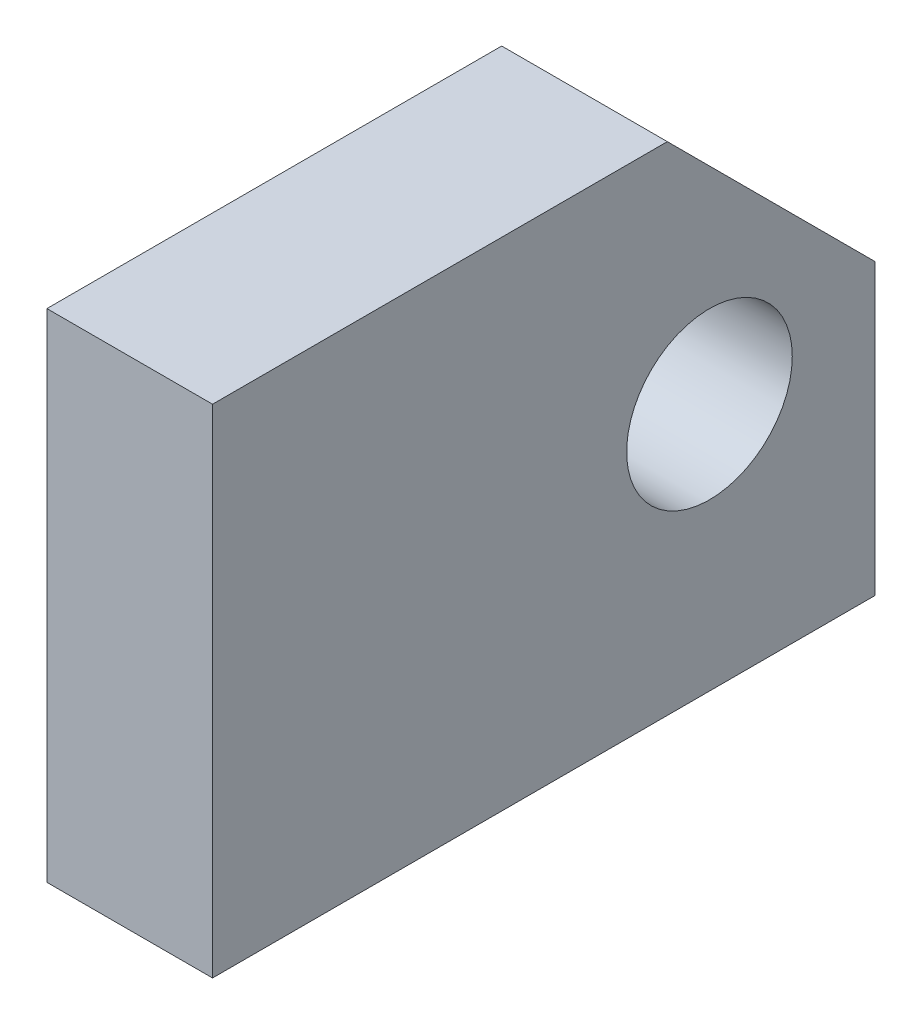
ISO-10303-21;
HEADER;
FILE_DESCRIPTION(('STEP AP214'),'2;1');
FILE_NAME('part.step','',(''),(''),'','','');
FILE_SCHEMA(('AUTOMOTIVE_DESIGN { 1 0 10303 214 1 1 1 1 }'));
ENDSEC;
DATA;
#1=APPLICATION_CONTEXT('core data for automotive mechanical design processes');
#2=APPLICATION_PROTOCOL_DEFINITION('international standard','automotive_design',2000,#1);
#3=PRODUCT_CONTEXT('',#1,'mechanical');
#4=PRODUCT('Part','Part','',(#3));
#5=PRODUCT_RELATED_PRODUCT_CATEGORY('part','',(#4));
#6=PRODUCT_DEFINITION_FORMATION('','',#4);
#7=PRODUCT_DEFINITION_CONTEXT('part definition',#1,'design');
#8=PRODUCT_DEFINITION('design','',#6,#7);
#9=PRODUCT_DEFINITION_SHAPE('','',#8);
#10=(LENGTH_UNIT() NAMED_UNIT(*) SI_UNIT(.MILLI.,.METRE.));
#11=(NAMED_UNIT(*) PLANE_ANGLE_UNIT() SI_UNIT($,.RADIAN.));
#12=(NAMED_UNIT(*) SI_UNIT($,.STERADIAN.) SOLID_ANGLE_UNIT());
#13=UNCERTAINTY_MEASURE_WITH_UNIT(LENGTH_MEASURE(1.E-05),#10,'distance_accuracy_value','');
#14=(GEOMETRIC_REPRESENTATION_CONTEXT(3) GLOBAL_UNCERTAINTY_ASSIGNED_CONTEXT((#13)) GLOBAL_UNIT_ASSIGNED_CONTEXT((#10,
#11,#12)) REPRESENTATION_CONTEXT('',''));
#15=CARTESIAN_POINT('',(0.,0.,0.));
#16=DIRECTION('',(0.,0.,1.));
#17=DIRECTION('',(1.,0.,0.));
#18=AXIS2_PLACEMENT_3D('',#15,#16,#17);
#19=CARTESIAN_POINT('',(10.,0.,0.));
#20=DIRECTION('',(-1.,0.,0.));
#21=DIRECTION('',(0.,0.,1.));
#22=AXIS2_PLACEMENT_3D('',#19,#20,#21);
#23=PLANE('',#22);
#24=DIRECTION('',(0.,-1.,0.));
#25=VECTOR('',#24,1.);
#26=CARTESIAN_POINT('',(10.,-15.,20.));
#27=LINE('',#26,#25);
#28=CARTESIAN_POINT('',(10.,15.,20.));
#29=VERTEX_POINT('',#28);
#30=CARTESIAN_POINT('',(10.,-15.,20.));
#31=VERTEX_POINT('',#30);
#32=EDGE_CURVE('E123',#29,#31,#27,.T.);
#33=ORIENTED_EDGE('',*,*,#32,.T.);
#34=DIRECTION('',(0.,0.,-1.));
#35=VECTOR('',#34,1.);
#36=CARTESIAN_POINT('',(10.,-15.,20.));
#37=LINE('',#36,#35);
#38=CARTESIAN_POINT('',(10.,-15.,-20.));
#39=VERTEX_POINT('',#38);
#40=EDGE_CURVE('E90',#31,#39,#37,.T.);
#41=ORIENTED_EDGE('',*,*,#40,.T.);
#42=DIRECTION('',(0.,1.,0.));
#43=VECTOR('',#42,1.);
#44=CARTESIAN_POINT('',(10.,-15.,-20.));
#45=LINE('',#44,#43);
#46=CARTESIAN_POINT('',(10.,2.45669070992441,-20.));
#47=VERTEX_POINT('',#46);
#48=EDGE_CURVE('E94',#39,#47,#45,.T.);
#49=ORIENTED_EDGE('',*,*,#48,.T.);
#50=DIRECTION('',(0.,0.707106781186539,0.707106781186556));
#51=VECTOR('',#50,1.);
#52=CARTESIAN_POINT('',(10.,15.,-7.45669070992411));
#53=LINE('',#52,#51);
#54=CARTESIAN_POINT('',(10.,15.,-7.45669070992411));
#55=VERTEX_POINT('',#54);
#56=EDGE_CURVE('E98',#47,#55,#53,.T.);
#57=ORIENTED_EDGE('',*,*,#56,.T.);
#58=DIRECTION('',(0.,0.,1.));
#59=VECTOR('',#58,1.);
#60=CARTESIAN_POINT('',(10.,15.,20.));
#61=LINE('',#60,#59);
#62=EDGE_CURVE('E56',#55,#29,#61,.T.);
#63=ORIENTED_EDGE('',*,*,#62,.T.);
#64=EDGE_LOOP('',(#33,#41,#49,#57,#63));
#65=FACE_BOUND('',#64,.T.);
#66=CARTESIAN_POINT('',(10.,0.,-10.));
#67=DIRECTION('',(1.,0.,0.));
#68=DIRECTION('',(0.,0.,-1.));
#69=AXIS2_PLACEMENT_3D('',#66,#67,#68);
#70=CIRCLE('',#69,5.);
#71=CARTESIAN_POINT('',(10.,0.,-15.));
#72=VERTEX_POINT('',#71);
#73=EDGE_CURVE('E118',#72,#72,#70,.T.);
#74=ORIENTED_EDGE('',*,*,#73,.F.);
#75=EDGE_LOOP('',(#74));
#76=FACE_BOUND('',#75,.T.);
#77=ADVANCED_FACE('F39',(#65,#76),#23,.F.);
#78=CARTESIAN_POINT('',(0.,0.,0.));
#79=DIRECTION('',(-1.,0.,0.));
#80=DIRECTION('',(0.,0.,1.));
#81=AXIS2_PLACEMENT_3D('',#78,#79,#80);
#82=PLANE('',#81);
#83=DIRECTION('',(0.,-1.,0.));
#84=VECTOR('',#83,1.);
#85=CARTESIAN_POINT('',(0.,-15.,20.));
#86=LINE('',#85,#84);
#87=CARTESIAN_POINT('',(0.,15.,20.));
#88=VERTEX_POINT('',#87);
#89=CARTESIAN_POINT('',(0.,-15.,20.));
#90=VERTEX_POINT('',#89);
#91=EDGE_CURVE('E114',#88,#90,#86,.T.);
#92=ORIENTED_EDGE('',*,*,#91,.F.);
#93=DIRECTION('',(0.,0.,1.));
#94=VECTOR('',#93,1.);
#95=CARTESIAN_POINT('',(0.,15.,20.));
#96=LINE('',#95,#94);
#97=CARTESIAN_POINT('',(0.,15.,-7.45669070992411));
#98=VERTEX_POINT('',#97);
#99=EDGE_CURVE('E82',#98,#88,#96,.T.);
#100=ORIENTED_EDGE('',*,*,#99,.F.);
#101=DIRECTION('',(0.,0.707106781186539,0.707106781186556));
#102=VECTOR('',#101,1.);
#103=CARTESIAN_POINT('',(0.,15.,-7.45669070992411));
#104=LINE('',#103,#102);
#105=CARTESIAN_POINT('',(0.,2.45669070992441,-20.));
#106=VERTEX_POINT('',#105);
#107=EDGE_CURVE('E76',#106,#98,#104,.T.);
#108=ORIENTED_EDGE('',*,*,#107,.F.);
#109=DIRECTION('',(0.,1.,0.));
#110=VECTOR('',#109,1.);
#111=CARTESIAN_POINT('',(0.,-15.,-20.));
#112=LINE('',#111,#110);
#113=CARTESIAN_POINT('',(0.,-15.,-20.));
#114=VERTEX_POINT('',#113);
#115=EDGE_CURVE('E105',#114,#106,#112,.T.);
#116=ORIENTED_EDGE('',*,*,#115,.F.);
#117=DIRECTION('',(0.,0.,-1.));
#118=VECTOR('',#117,1.);
#119=CARTESIAN_POINT('',(0.,-15.,20.));
#120=LINE('',#119,#118);
#121=EDGE_CURVE('E117',#90,#114,#120,.T.);
#122=ORIENTED_EDGE('',*,*,#121,.F.);
#123=EDGE_LOOP('',(#92,#100,#108,#116,#122));
#124=FACE_BOUND('',#123,.T.);
#125=CARTESIAN_POINT('',(0.,0.,-10.));
#126=DIRECTION('',(1.,0.,0.));
#127=DIRECTION('',(0.,0.,-1.));
#128=AXIS2_PLACEMENT_3D('',#125,#126,#127);
#129=CIRCLE('',#128,5.);
#130=CARTESIAN_POINT('',(0.,0.,-15.));
#131=VERTEX_POINT('',#130);
#132=EDGE_CURVE('E203',#131,#131,#129,.T.);
#133=ORIENTED_EDGE('',*,*,#132,.T.);
#134=EDGE_LOOP('',(#133));
#135=FACE_BOUND('',#134,.T.);
#136=ADVANCED_FACE('F127',(#124,#135),#82,.T.);
#137=CARTESIAN_POINT('',(10.,-15.,20.));
#138=DIRECTION('',(0.,0.,-1.));
#139=DIRECTION('',(-1.,0.,0.));
#140=AXIS2_PLACEMENT_3D('',#137,#138,#139);
#141=PLANE('',#140);
#142=ORIENTED_EDGE('',*,*,#91,.T.);
#143=DIRECTION('',(-1.,0.,0.));
#144=VECTOR('',#143,1.);
#145=CARTESIAN_POINT('',(10.,-15.,20.));
#146=LINE('',#145,#144);
#147=EDGE_CURVE('E11',#31,#90,#146,.T.);
#148=ORIENTED_EDGE('',*,*,#147,.F.);
#149=ORIENTED_EDGE('',*,*,#32,.F.);
#150=DIRECTION('',(-1.,0.,0.));
#151=VECTOR('',#150,1.);
#152=CARTESIAN_POINT('',(10.,15.,20.));
#153=LINE('',#152,#151);
#154=EDGE_CURVE('E110',#29,#88,#153,.T.);
#155=ORIENTED_EDGE('',*,*,#154,.T.);
#156=EDGE_LOOP('',(#142,#148,#149,#155));
#157=FACE_BOUND('',#156,.T.);
#158=ADVANCED_FACE('F41',(#157),#141,.F.);
#159=CARTESIAN_POINT('',(10.,-15.,20.));
#160=DIRECTION('',(0.,1.,0.));
#161=DIRECTION('',(0.,0.,1.));
#162=AXIS2_PLACEMENT_3D('',#159,#160,#161);
#163=PLANE('',#162);
#164=ORIENTED_EDGE('',*,*,#121,.T.);
#165=DIRECTION('',(-1.,0.,0.));
#166=VECTOR('',#165,1.);
#167=CARTESIAN_POINT('',(10.,-15.,-20.));
#168=LINE('',#167,#166);
#169=EDGE_CURVE('E48',#39,#114,#168,.T.);
#170=ORIENTED_EDGE('',*,*,#169,.F.);
#171=ORIENTED_EDGE('',*,*,#40,.F.);
#172=ORIENTED_EDGE('',*,*,#147,.T.);
#173=EDGE_LOOP('',(#164,#170,#171,#172));
#174=FACE_BOUND('',#173,.T.);
#175=ADVANCED_FACE('F152',(#174),#163,.F.);
#176=CARTESIAN_POINT('',(10.,-15.,-20.));
#177=DIRECTION('',(0.,0.,1.));
#178=DIRECTION('',(0.,-1.,0.));
#179=AXIS2_PLACEMENT_3D('',#176,#177,#178);
#180=PLANE('',#179);
#181=ORIENTED_EDGE('',*,*,#115,.T.);
#182=DIRECTION('',(-1.,0.,0.));
#183=VECTOR('',#182,1.);
#184=CARTESIAN_POINT('',(10.,2.45669070992441,-20.));
#185=LINE('',#184,#183);
#186=EDGE_CURVE('E102',#47,#106,#185,.T.);
#187=ORIENTED_EDGE('',*,*,#186,.F.);
#188=ORIENTED_EDGE('',*,*,#48,.F.);
#189=ORIENTED_EDGE('',*,*,#169,.T.);
#190=EDGE_LOOP('',(#181,#187,#188,#189));
#191=FACE_BOUND('',#190,.T.);
#192=ADVANCED_FACE('F103',(#191),#180,.F.);
#193=CARTESIAN_POINT('',(10.,15.,-7.45669070992411));
#194=DIRECTION('',(0.,-0.707106781186556,0.707106781186539));
#195=DIRECTION('',(0.,-0.707106781186539,-0.707106781186556));
#196=AXIS2_PLACEMENT_3D('',#193,#194,#195);
#197=PLANE('',#196);
#198=ORIENTED_EDGE('',*,*,#107,.T.);
#199=DIRECTION('',(-1.,0.,0.));
#200=VECTOR('',#199,1.);
#201=CARTESIAN_POINT('',(10.,15.,-7.45669070992411));
#202=LINE('',#201,#200);
#203=EDGE_CURVE('E106',#55,#98,#202,.T.);
#204=ORIENTED_EDGE('',*,*,#203,.F.);
#205=ORIENTED_EDGE('',*,*,#56,.F.);
#206=ORIENTED_EDGE('',*,*,#186,.T.);
#207=EDGE_LOOP('',(#198,#204,#205,#206));
#208=FACE_BOUND('',#207,.T.);
#209=ADVANCED_FACE('F108',(#208),#197,.F.);
#210=CARTESIAN_POINT('',(10.,15.,20.));
#211=DIRECTION('',(0.,-1.,0.));
#212=DIRECTION('',(0.,0.,-1.));
#213=AXIS2_PLACEMENT_3D('',#210,#211,#212);
#214=PLANE('',#213);
#215=ORIENTED_EDGE('',*,*,#99,.T.);
#216=ORIENTED_EDGE('',*,*,#154,.F.);
#217=ORIENTED_EDGE('',*,*,#62,.F.);
#218=ORIENTED_EDGE('',*,*,#203,.T.);
#219=EDGE_LOOP('',(#215,#216,#217,#218));
#220=FACE_BOUND('',#219,.T.);
#221=ADVANCED_FACE('F132',(#220),#214,.F.);
#222=CARTESIAN_POINT('',(10.,0.,-10.));
#223=DIRECTION('',(-1.,0.,0.));
#224=DIRECTION('',(0.,0.,1.));
#225=AXIS2_PLACEMENT_3D('',#222,#223,#224);
#226=CYLINDRICAL_SURFACE('',#225,5.);
#227=ORIENTED_EDGE('',*,*,#73,.T.);
#228=EDGE_LOOP('',(#227));
#229=FACE_BOUND('',#228,.T.);
#230=ORIENTED_EDGE('',*,*,#132,.F.);
#231=EDGE_LOOP('',(#230));
#232=FACE_BOUND('',#231,.T.);
#233=ADVANCED_FACE('F134',(#229,#232),#226,.F.);
#234=CLOSED_SHELL('',(#77,#136,#158,#175,#192,#209,#221,#233));
#235=MANIFOLD_SOLID_BREP('B2',#234);
#236=ADVANCED_BREP_SHAPE_REPRESENTATION('',(#18,#235),#14);
#237=SHAPE_DEFINITION_REPRESENTATION(#9,#236);
ENDSEC;
END-ISO-10303-21;
